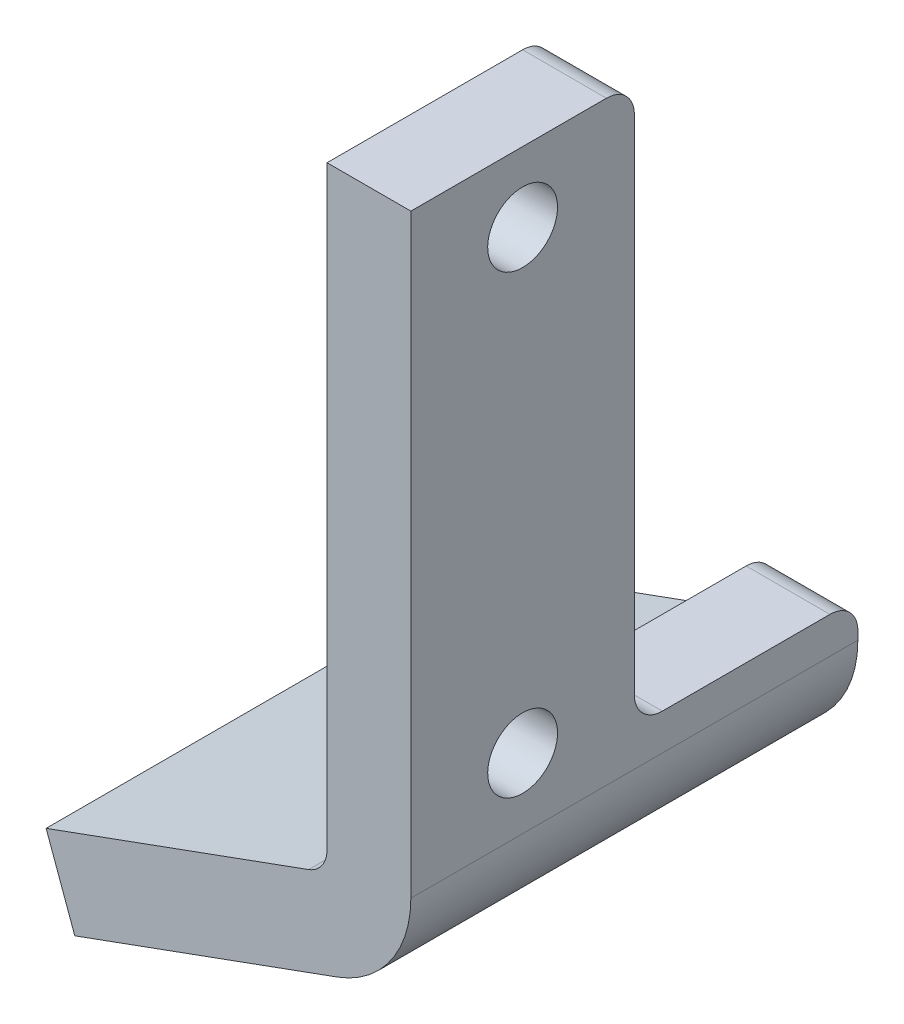
ISO-10303-21;
HEADER;
FILE_DESCRIPTION(('STEP AP214'),'2;1');
FILE_NAME('part.step','',(''),(''),'','','');
FILE_SCHEMA(('AUTOMOTIVE_DESIGN { 1 0 10303 214 1 1 1 1 }'));
ENDSEC;
DATA;
#1=APPLICATION_CONTEXT('core data for automotive mechanical design processes');
#2=APPLICATION_PROTOCOL_DEFINITION('international standard','automotive_design',2000,#1);
#3=PRODUCT_CONTEXT('',#1,'mechanical');
#4=PRODUCT('Part','Part','',(#3));
#5=PRODUCT_RELATED_PRODUCT_CATEGORY('part','',(#4));
#6=PRODUCT_DEFINITION_FORMATION('','',#4);
#7=PRODUCT_DEFINITION_CONTEXT('part definition',#1,'design');
#8=PRODUCT_DEFINITION('design','',#6,#7);
#9=PRODUCT_DEFINITION_SHAPE('','',#8);
#10=(LENGTH_UNIT() NAMED_UNIT(*) SI_UNIT(.MILLI.,.METRE.));
#11=(NAMED_UNIT(*) PLANE_ANGLE_UNIT() SI_UNIT($,.RADIAN.));
#12=(NAMED_UNIT(*) SI_UNIT($,.STERADIAN.) SOLID_ANGLE_UNIT());
#13=UNCERTAINTY_MEASURE_WITH_UNIT(LENGTH_MEASURE(1.E-05),#10,'distance_accuracy_value','');
#14=(GEOMETRIC_REPRESENTATION_CONTEXT(3) GLOBAL_UNCERTAINTY_ASSIGNED_CONTEXT((#13)) GLOBAL_UNIT_ASSIGNED_CONTEXT((#10,
#11,#12)) REPRESENTATION_CONTEXT('',''));
#15=CARTESIAN_POINT('',(0.,0.,0.));
#16=DIRECTION('',(0.,0.,1.));
#17=DIRECTION('',(1.,0.,0.));
#18=AXIS2_PLACEMENT_3D('',#15,#16,#17);
#19=CARTESIAN_POINT('',(-1.5,20.3,-16.));
#20=DIRECTION('',(-1.,0.,0.));
#21=DIRECTION('',(0.,-1.,0.));
#22=AXIS2_PLACEMENT_3D('',#19,#20,#21);
#23=PLANE('',#22);
#24=DIRECTION('',(0.,0.,1.));
#25=VECTOR('',#24,1.);
#26=CARTESIAN_POINT('',(-1.5,0.299999999999998,-8.));
#27=LINE('',#26,#25);
#28=CARTESIAN_POINT('',(-1.5,0.300000000000001,-15.));
#29=VERTEX_POINT('',#28);
#30=CARTESIAN_POINT('',(-1.5,0.299999999999998,-9.));
#31=VERTEX_POINT('',#30);
#32=EDGE_CURVE('E226',#29,#31,#27,.T.);
#33=ORIENTED_EDGE('',*,*,#32,.F.);
#34=CARTESIAN_POINT('',(-1.5,-0.699999999999999,-15.));
#35=DIRECTION('',(-1.,0.,0.));
#36=DIRECTION('',(0.,-1.,0.));
#37=AXIS2_PLACEMENT_3D('',#34,#35,#36);
#38=CIRCLE('',#37,1.);
#39=CARTESIAN_POINT('',(-1.5,-0.699999999999999,-16.));
#40=VERTEX_POINT('',#39);
#41=EDGE_CURVE('E135',#29,#40,#38,.T.);
#42=ORIENTED_EDGE('',*,*,#41,.T.);
#43=DIRECTION('',(0.,-1.,0.));
#44=VECTOR('',#43,1.);
#45=CARTESIAN_POINT('',(-1.5,20.3,-16.));
#46=LINE('',#45,#44);
#47=CARTESIAN_POINT('',(-1.5,-1.,-16.));
#48=VERTEX_POINT('',#47);
#49=EDGE_CURVE('E128',#40,#48,#46,.T.);
#50=ORIENTED_EDGE('',*,*,#49,.T.);
#51=DIRECTION('',(0.,0.,1.));
#52=VECTOR('',#51,1.);
#53=CARTESIAN_POINT('',(-1.5,-1.,-16.));
#54=LINE('',#53,#52);
#55=CARTESIAN_POINT('',(-1.5,-1.,0.));
#56=VERTEX_POINT('',#55);
#57=EDGE_CURVE('E133',#48,#56,#54,.T.);
#58=ORIENTED_EDGE('',*,*,#57,.T.);
#59=DIRECTION('',(0.,-1.,0.));
#60=VECTOR('',#59,1.);
#61=CARTESIAN_POINT('',(-1.5,20.3,0.));
#62=LINE('',#61,#60);
#63=CARTESIAN_POINT('',(-1.5,20.3,0.));
#64=VERTEX_POINT('',#63);
#65=EDGE_CURVE('E171',#64,#56,#62,.T.);
#66=ORIENTED_EDGE('',*,*,#65,.F.);
#67=DIRECTION('',(0.,0.,1.));
#68=VECTOR('',#67,1.);
#69=CARTESIAN_POINT('',(-1.5,20.3,-16.));
#70=LINE('',#69,#68);
#71=CARTESIAN_POINT('',(-1.5,20.3,-7.));
#72=VERTEX_POINT('',#71);
#73=EDGE_CURVE('E192',#72,#64,#70,.T.);
#74=ORIENTED_EDGE('',*,*,#73,.F.);
#75=CARTESIAN_POINT('',(-1.5,19.3,-7.));
#76=DIRECTION('',(-1.,0.,0.));
#77=DIRECTION('',(0.,-1.,0.));
#78=AXIS2_PLACEMENT_3D('',#75,#76,#77);
#79=CIRCLE('',#78,1.);
#80=CARTESIAN_POINT('',(-1.5,19.3,-8.));
#81=VERTEX_POINT('',#80);
#82=EDGE_CURVE('E210',#72,#81,#79,.T.);
#83=ORIENTED_EDGE('',*,*,#82,.T.);
#84=DIRECTION('',(0.,1.,0.));
#85=VECTOR('',#84,1.);
#86=CARTESIAN_POINT('',(-1.5,20.3,-8.));
#87=LINE('',#86,#85);
#88=CARTESIAN_POINT('',(-1.5,1.3,-8.));
#89=VERTEX_POINT('',#88);
#90=EDGE_CURVE('E227',#89,#81,#87,.T.);
#91=ORIENTED_EDGE('',*,*,#90,.F.);
#92=CARTESIAN_POINT('',(-1.5,1.3,-9.));
#93=DIRECTION('',(-1.,0.,0.));
#94=DIRECTION('',(0.,-1.,0.));
#95=AXIS2_PLACEMENT_3D('',#92,#93,#94);
#96=CIRCLE('',#95,1.);
#97=EDGE_CURVE('E41',#89,#31,#96,.F.);
#98=ORIENTED_EDGE('',*,*,#97,.T.);
#99=EDGE_LOOP('',(#33,#42,#50,#58,#66,#74,#83,#91,#98));
#100=FACE_BOUND('',#99,.T.);
#101=CARTESIAN_POINT('',(-1.5,1.5,-4.));
#102=DIRECTION('',(-1.,0.,0.));
#103=DIRECTION('',(0.,-1.,0.));
#104=AXIS2_PLACEMENT_3D('',#101,#102,#103);
#105=CIRCLE('',#104,1.25);
#106=CARTESIAN_POINT('',(-1.5,0.249999999999997,-4.));
#107=VERTEX_POINT('',#106);
#108=EDGE_CURVE('E244',#107,#107,#105,.T.);
#109=ORIENTED_EDGE('',*,*,#108,.F.);
#110=EDGE_LOOP('',(#109));
#111=FACE_BOUND('',#110,.T.);
#112=CARTESIAN_POINT('',(-1.5,17.8,-4.));
#113=DIRECTION('',(-1.,0.,0.));
#114=DIRECTION('',(0.,-1.,0.));
#115=AXIS2_PLACEMENT_3D('',#112,#113,#114);
#116=CIRCLE('',#115,1.25);
#117=CARTESIAN_POINT('',(-1.5,16.55,-4.));
#118=VERTEX_POINT('',#117);
#119=EDGE_CURVE('E256',#118,#118,#116,.T.);
#120=ORIENTED_EDGE('',*,*,#119,.F.);
#121=EDGE_LOOP('',(#120));
#122=FACE_BOUND('',#121,.T.);
#123=ADVANCED_FACE('F33',(#100,#111,#122),#23,.T.);
#124=CARTESIAN_POINT('',(-1.5,20.3,-16.));
#125=DIRECTION('',(0.,1.,0.));
#126=DIRECTION('',(0.,0.,1.));
#127=AXIS2_PLACEMENT_3D('',#124,#125,#126);
#128=PLANE('',#127);
#129=DIRECTION('',(0.,0.,1.));
#130=VECTOR('',#129,1.);
#131=CARTESIAN_POINT('',(1.5,20.3,-16.));
#132=LINE('',#131,#130);
#133=CARTESIAN_POINT('',(1.5,20.3,-7.));
#134=VERTEX_POINT('',#133);
#135=CARTESIAN_POINT('',(1.5,20.3,0.));
#136=VERTEX_POINT('',#135);
#137=EDGE_CURVE('E195',#134,#136,#132,.T.);
#138=ORIENTED_EDGE('',*,*,#137,.F.);
#139=DIRECTION('',(-1.,0.,0.));
#140=VECTOR('',#139,1.);
#141=CARTESIAN_POINT('',(-1.5,20.3,-7.));
#142=LINE('',#141,#140);
#143=EDGE_CURVE('E222',#134,#72,#142,.T.);
#144=ORIENTED_EDGE('',*,*,#143,.T.);
#145=ORIENTED_EDGE('',*,*,#73,.T.);
#146=DIRECTION('',(-1.,0.,0.));
#147=VECTOR('',#146,1.);
#148=CARTESIAN_POINT('',(-1.5,20.3,0.));
#149=LINE('',#148,#147);
#150=EDGE_CURVE('E140',#136,#64,#149,.T.);
#151=ORIENTED_EDGE('',*,*,#150,.F.);
#152=EDGE_LOOP('',(#138,#144,#145,#151));
#153=FACE_BOUND('',#152,.T.);
#154=ADVANCED_FACE('F286',(#153),#128,.T.);
#155=CARTESIAN_POINT('',(1.5,20.3,-16.));
#156=DIRECTION('',(1.,0.,0.));
#157=DIRECTION('',(0.,1.,0.));
#158=AXIS2_PLACEMENT_3D('',#155,#156,#157);
#159=PLANE('',#158);
#160=DIRECTION('',(0.,1.,0.));
#161=VECTOR('',#160,1.);
#162=CARTESIAN_POINT('',(1.5,20.3,-16.));
#163=LINE('',#162,#161);
#164=CARTESIAN_POINT('',(1.5,-1.,-16.));
#165=VERTEX_POINT('',#164);
#166=CARTESIAN_POINT('',(1.5,-0.699999999999999,-16.));
#167=VERTEX_POINT('',#166);
#168=EDGE_CURVE('E149',#165,#167,#163,.T.);
#169=ORIENTED_EDGE('',*,*,#168,.T.);
#170=CARTESIAN_POINT('',(1.5,-0.699999999999999,-15.));
#171=DIRECTION('',(1.,0.,0.));
#172=DIRECTION('',(0.,1.,0.));
#173=AXIS2_PLACEMENT_3D('',#170,#171,#172);
#174=CIRCLE('',#173,1.);
#175=CARTESIAN_POINT('',(1.50000000000001,0.300000000000001,-15.));
#176=VERTEX_POINT('',#175);
#177=EDGE_CURVE('E216',#167,#176,#174,.T.);
#178=ORIENTED_EDGE('',*,*,#177,.T.);
#179=DIRECTION('',(0.,0.,1.));
#180=VECTOR('',#179,1.);
#181=CARTESIAN_POINT('',(1.50000000000001,0.299999999999998,-8.));
#182=LINE('',#181,#180);
#183=CARTESIAN_POINT('',(1.50000000000001,0.299999999999999,-9.));
#184=VERTEX_POINT('',#183);
#185=EDGE_CURVE('E242',#176,#184,#182,.T.);
#186=ORIENTED_EDGE('',*,*,#185,.T.);
#187=CARTESIAN_POINT('',(1.5,1.3,-9.));
#188=DIRECTION('',(1.,0.,0.));
#189=DIRECTION('',(0.,1.,0.));
#190=AXIS2_PLACEMENT_3D('',#187,#188,#189);
#191=CIRCLE('',#190,1.);
#192=CARTESIAN_POINT('',(1.50000000000001,1.3,-8.));
#193=VERTEX_POINT('',#192);
#194=EDGE_CURVE('E11',#184,#193,#191,.F.);
#195=ORIENTED_EDGE('',*,*,#194,.T.);
#196=DIRECTION('',(0.,1.,0.));
#197=VECTOR('',#196,1.);
#198=CARTESIAN_POINT('',(1.5,20.3,-8.));
#199=LINE('',#198,#197);
#200=CARTESIAN_POINT('',(1.5,19.3,-8.));
#201=VERTEX_POINT('',#200);
#202=EDGE_CURVE('E241',#193,#201,#199,.T.);
#203=ORIENTED_EDGE('',*,*,#202,.T.);
#204=CARTESIAN_POINT('',(1.5,19.3,-7.));
#205=DIRECTION('',(1.,0.,0.));
#206=DIRECTION('',(0.,1.,0.));
#207=AXIS2_PLACEMENT_3D('',#204,#205,#206);
#208=CIRCLE('',#207,1.);
#209=EDGE_CURVE('E48',#201,#134,#208,.T.);
#210=ORIENTED_EDGE('',*,*,#209,.T.);
#211=ORIENTED_EDGE('',*,*,#137,.T.);
#212=DIRECTION('',(0.,1.,0.));
#213=VECTOR('',#212,1.);
#214=CARTESIAN_POINT('',(1.5,20.3,0.));
#215=LINE('',#214,#213);
#216=CARTESIAN_POINT('',(1.5,-1.,0.));
#217=VERTEX_POINT('',#216);
#218=EDGE_CURVE('E187',#217,#136,#215,.T.);
#219=ORIENTED_EDGE('',*,*,#218,.F.);
#220=DIRECTION('',(0.,0.,1.));
#221=VECTOR('',#220,1.);
#222=CARTESIAN_POINT('',(1.5,-1.,-16.));
#223=LINE('',#222,#221);
#224=EDGE_CURVE('E197',#165,#217,#223,.T.);
#225=ORIENTED_EDGE('',*,*,#224,.F.);
#226=EDGE_LOOP('',(#169,#178,#186,#195,#203,#210,#211,#219,#225));
#227=FACE_BOUND('',#226,.T.);
#228=CARTESIAN_POINT('',(1.50000000000001,1.5,-4.));
#229=DIRECTION('',(-1.,0.,0.));
#230=DIRECTION('',(0.,-1.,0.));
#231=AXIS2_PLACEMENT_3D('',#228,#229,#230);
#232=CIRCLE('',#231,1.25);
#233=CARTESIAN_POINT('',(1.50000000000001,0.249999999999998,-4.));
#234=VERTEX_POINT('',#233);
#235=EDGE_CURVE('E247',#234,#234,#232,.T.);
#236=ORIENTED_EDGE('',*,*,#235,.T.);
#237=EDGE_LOOP('',(#236));
#238=FACE_BOUND('',#237,.T.);
#239=CARTESIAN_POINT('',(1.5,17.8,-4.));
#240=DIRECTION('',(-1.,0.,0.));
#241=DIRECTION('',(0.,-1.,0.));
#242=AXIS2_PLACEMENT_3D('',#239,#240,#241);
#243=CIRCLE('',#242,1.25);
#244=CARTESIAN_POINT('',(1.5,16.55,-4.));
#245=VERTEX_POINT('',#244);
#246=EDGE_CURVE('E252',#245,#245,#243,.T.);
#247=ORIENTED_EDGE('',*,*,#246,.T.);
#248=EDGE_LOOP('',(#247));
#249=FACE_BOUND('',#248,.T.);
#250=ADVANCED_FACE('F239',(#227,#238,#249),#159,.T.);
#251=CARTESIAN_POINT('',(-2.5,-1.,-16.));
#252=DIRECTION('',(0.,0.,1.));
#253=DIRECTION('',(1.,0.,0.));
#254=AXIS2_PLACEMENT_3D('',#251,#252,#253);
#255=CYLINDRICAL_SURFACE('',#254,4.);
#256=CARTESIAN_POINT('',(-2.5,-1.,0.));
#257=DIRECTION('',(0.,0.,1.));
#258=DIRECTION('',(-1.,0.,0.));
#259=AXIS2_PLACEMENT_3D('',#256,#257,#258);
#260=CIRCLE('',#259,4.);
#261=CARTESIAN_POINT('',(-1.13191942669734,-4.75877048314364,0.));
#262=VERTEX_POINT('',#261);
#263=EDGE_CURVE('E184',#262,#217,#260,.T.);
#264=ORIENTED_EDGE('',*,*,#263,.F.);
#265=DIRECTION('',(0.,0.,1.));
#266=VECTOR('',#265,1.);
#267=CARTESIAN_POINT('',(-1.13191942669734,-4.75877048314364,-16.));
#268=LINE('',#267,#266);
#269=CARTESIAN_POINT('',(-1.13191942669734,-4.75877048314364,-16.));
#270=VERTEX_POINT('',#269);
#271=EDGE_CURVE('E199',#270,#262,#268,.T.);
#272=ORIENTED_EDGE('',*,*,#271,.F.);
#273=CARTESIAN_POINT('',(-2.5,-1.,-16.));
#274=DIRECTION('',(0.,0.,1.));
#275=DIRECTION('',(-1.,0.,0.));
#276=AXIS2_PLACEMENT_3D('',#273,#274,#275);
#277=CIRCLE('',#276,4.);
#278=EDGE_CURVE('E166',#270,#165,#277,.T.);
#279=ORIENTED_EDGE('',*,*,#278,.T.);
#280=ORIENTED_EDGE('',*,*,#224,.T.);
#281=EDGE_LOOP('',(#264,#272,#279,#280));
#282=FACE_BOUND('',#281,.T.);
#283=ADVANCED_FACE('F270',(#282),#255,.T.);
#284=CARTESIAN_POINT('',(-10.5288456345564,-8.17897191640028,-16.));
#285=DIRECTION('',(0.342020143325663,-0.93969262078591,0.));
#286=DIRECTION('',(0.93969262078591,0.342020143325663,0.));
#287=AXIS2_PLACEMENT_3D('',#284,#285,#286);
#288=PLANE('',#287);
#289=CARTESIAN_POINT('',(-5.8303825306269,-6.46887119977196,-11.));
#290=DIRECTION('',(0.342020143325663,-0.93969262078591,0.));
#291=DIRECTION('',(0.93969262078591,0.342020143325663,0.));
#292=AXIS2_PLACEMENT_3D('',#289,#290,#291);
#293=CIRCLE('',#292,2.25);
#294=CARTESIAN_POINT('',(-3.7160741338586,-5.69932587728922,-11.));
#295=VERTEX_POINT('',#294);
#296=EDGE_CURVE('E173',#295,#295,#293,.T.);
#297=ORIENTED_EDGE('',*,*,#296,.F.);
#298=EDGE_LOOP('',(#297));
#299=FACE_BOUND('',#298,.T.);
#300=DIRECTION('',(0.93969262078591,0.342020143325663,0.));
#301=VECTOR('',#300,1.);
#302=CARTESIAN_POINT('',(-10.5288456345564,-8.17897191640028,0.));
#303=LINE('',#302,#301);
#304=CARTESIAN_POINT('',(-10.5288456345564,-8.17897191640028,0.));
#305=VERTEX_POINT('',#304);
#306=EDGE_CURVE('E181',#305,#262,#303,.T.);
#307=ORIENTED_EDGE('',*,*,#306,.F.);
#308=DIRECTION('',(0.,0.,1.));
#309=VECTOR('',#308,1.);
#310=CARTESIAN_POINT('',(-10.5288456345564,-8.17897191640028,-16.));
#311=LINE('',#310,#309);
#312=CARTESIAN_POINT('',(-10.5288456345564,-8.17897191640028,-16.));
#313=VERTEX_POINT('',#312);
#314=EDGE_CURVE('E201',#313,#305,#311,.T.);
#315=ORIENTED_EDGE('',*,*,#314,.F.);
#316=DIRECTION('',(0.93969262078591,0.342020143325663,0.));
#317=VECTOR('',#316,1.);
#318=CARTESIAN_POINT('',(-10.5288456345564,-8.17897191640028,-16.));
#319=LINE('',#318,#317);
#320=EDGE_CURVE('E163',#313,#270,#319,.T.);
#321=ORIENTED_EDGE('',*,*,#320,.T.);
#322=ORIENTED_EDGE('',*,*,#271,.T.);
#323=EDGE_LOOP('',(#307,#315,#321,#322));
#324=FACE_BOUND('',#323,.T.);
#325=ADVANCED_FACE('F266',(#299,#324),#288,.T.);
#326=CARTESIAN_POINT('',(-11.5549060645334,-5.35989405404254,-16.));
#327=DIRECTION('',(-0.93969262078591,-0.342020143325663,0.));
#328=DIRECTION('',(0.342020143325663,-0.93969262078591,0.));
#329=AXIS2_PLACEMENT_3D('',#326,#327,#328);
#330=PLANE('',#329);
#331=DIRECTION('',(0.342020143325663,-0.93969262078591,0.));
#332=VECTOR('',#331,1.);
#333=CARTESIAN_POINT('',(-11.5549060645334,-5.35989405404254,0.));
#334=LINE('',#333,#332);
#335=CARTESIAN_POINT('',(-11.5549060645334,-5.35989405404254,0.));
#336=VERTEX_POINT('',#335);
#337=EDGE_CURVE('E178',#336,#305,#334,.T.);
#338=ORIENTED_EDGE('',*,*,#337,.F.);
#339=DIRECTION('',(0.,0.,1.));
#340=VECTOR('',#339,1.);
#341=CARTESIAN_POINT('',(-11.5549060645334,-5.35989405404254,-16.));
#342=LINE('',#341,#340);
#343=CARTESIAN_POINT('',(-11.5549060645334,-5.35989405404254,-16.));
#344=VERTEX_POINT('',#343);
#345=EDGE_CURVE('E203',#344,#336,#342,.T.);
#346=ORIENTED_EDGE('',*,*,#345,.F.);
#347=DIRECTION('',(0.342020143325663,-0.93969262078591,0.));
#348=VECTOR('',#347,1.);
#349=CARTESIAN_POINT('',(-11.5549060645334,-5.35989405404254,-16.));
#350=LINE('',#349,#348);
#351=EDGE_CURVE('E157',#344,#313,#350,.T.);
#352=ORIENTED_EDGE('',*,*,#351,.T.);
#353=ORIENTED_EDGE('',*,*,#314,.T.);
#354=EDGE_LOOP('',(#338,#346,#352,#353));
#355=FACE_BOUND('',#354,.T.);
#356=ADVANCED_FACE('F269',(#355),#330,.T.);
#357=CARTESIAN_POINT('',(-2.15797985667434,-1.93969262078591,-16.));
#358=DIRECTION('',(-0.342020143325663,0.93969262078591,0.));
#359=DIRECTION('',(-0.939692620785911,-0.342020143325663,0.));
#360=AXIS2_PLACEMENT_3D('',#357,#358,#359);
#361=PLANE('',#360);
#362=CARTESIAN_POINT('',(-6.85644296060389,-3.64979333741423,-11.));
#363=DIRECTION('',(-0.342020143325663,0.939692620785911,0.));
#364=DIRECTION('',(-0.93969262078591,-0.342020143325663,0.));
#365=AXIS2_PLACEMENT_3D('',#362,#363,#364);
#366=CIRCLE('',#365,2.25);
#367=CARTESIAN_POINT('',(-8.97075135737219,-4.41933865989697,-11.));
#368=VERTEX_POINT('',#367);
#369=EDGE_CURVE('E255',#368,#368,#366,.T.);
#370=ORIENTED_EDGE('',*,*,#369,.F.);
#371=EDGE_LOOP('',(#370));
#372=FACE_BOUND('',#371,.T.);
#373=DIRECTION('',(-0.93969262078591,-0.342020143325663,0.));
#374=VECTOR('',#373,1.);
#375=CARTESIAN_POINT('',(-2.15797985667434,-1.93969262078591,0.));
#376=LINE('',#375,#374);
#377=CARTESIAN_POINT('',(-2.15797985667434,-1.93969262078591,0.));
#378=VERTEX_POINT('',#377);
#379=EDGE_CURVE('E175',#378,#336,#376,.T.);
#380=ORIENTED_EDGE('',*,*,#379,.F.);
#381=DIRECTION('',(0.,0.,1.));
#382=VECTOR('',#381,1.);
#383=CARTESIAN_POINT('',(-2.15797985667434,-1.93969262078591,-16.));
#384=LINE('',#383,#382);
#385=CARTESIAN_POINT('',(-2.15797985667434,-1.93969262078591,-16.));
#386=VERTEX_POINT('',#385);
#387=EDGE_CURVE('E148',#386,#378,#384,.T.);
#388=ORIENTED_EDGE('',*,*,#387,.F.);
#389=DIRECTION('',(-0.93969262078591,-0.342020143325663,0.));
#390=VECTOR('',#389,1.);
#391=CARTESIAN_POINT('',(-2.15797985667434,-1.93969262078591,-16.));
#392=LINE('',#391,#390);
#393=EDGE_CURVE('E155',#386,#344,#392,.T.);
#394=ORIENTED_EDGE('',*,*,#393,.T.);
#395=ORIENTED_EDGE('',*,*,#345,.T.);
#396=EDGE_LOOP('',(#380,#388,#394,#395));
#397=FACE_BOUND('',#396,.T.);
#398=ADVANCED_FACE('F282',(#372,#397),#361,.T.);
#399=CARTESIAN_POINT('',(-2.5,-1.,-16.));
#400=DIRECTION('',(0.,0.,1.));
#401=DIRECTION('',(1.,0.,0.));
#402=AXIS2_PLACEMENT_3D('',#399,#400,#401);
#403=CYLINDRICAL_SURFACE('',#402,0.999999999999999);
#404=CARTESIAN_POINT('',(-2.5,-1.,0.));
#405=DIRECTION('',(0.,0.,-1.));
#406=DIRECTION('',(-1.,0.,0.));
#407=AXIS2_PLACEMENT_3D('',#404,#405,#406);
#408=CIRCLE('',#407,0.999999999999999);
#409=EDGE_CURVE('E146',#56,#378,#408,.T.);
#410=ORIENTED_EDGE('',*,*,#409,.F.);
#411=ORIENTED_EDGE('',*,*,#57,.F.);
#412=CARTESIAN_POINT('',(-2.5,-1.,-16.));
#413=DIRECTION('',(0.,0.,-1.));
#414=DIRECTION('',(-1.,0.,0.));
#415=AXIS2_PLACEMENT_3D('',#412,#413,#414);
#416=CIRCLE('',#415,0.999999999999999);
#417=EDGE_CURVE('E139',#48,#386,#416,.T.);
#418=ORIENTED_EDGE('',*,*,#417,.T.);
#419=ORIENTED_EDGE('',*,*,#387,.T.);
#420=EDGE_LOOP('',(#410,#411,#418,#419));
#421=FACE_BOUND('',#420,.T.);
#422=ADVANCED_FACE('F144',(#421),#403,.F.);
#423=CARTESIAN_POINT('',(-2.5,-1.,-16.));
#424=DIRECTION('',(0.,0.,-1.));
#425=DIRECTION('',(-1.,0.,0.));
#426=AXIS2_PLACEMENT_3D('',#423,#424,#425);
#427=PLANE('',#426);
#428=ORIENTED_EDGE('',*,*,#49,.F.);
#429=DIRECTION('',(-1.,0.,0.));
#430=VECTOR('',#429,1.);
#431=CARTESIAN_POINT('',(1.5,-0.699999999999999,-16.));
#432=LINE('',#431,#430);
#433=EDGE_CURVE('E213',#40,#167,#432,.F.);
#434=ORIENTED_EDGE('',*,*,#433,.T.);
#435=ORIENTED_EDGE('',*,*,#168,.F.);
#436=ORIENTED_EDGE('',*,*,#278,.F.);
#437=ORIENTED_EDGE('',*,*,#320,.F.);
#438=ORIENTED_EDGE('',*,*,#351,.F.);
#439=ORIENTED_EDGE('',*,*,#393,.F.);
#440=ORIENTED_EDGE('',*,*,#417,.F.);
#441=EDGE_LOOP('',(#428,#434,#435,#436,#437,#438,#439,#440));
#442=FACE_BOUND('',#441,.T.);
#443=ADVANCED_FACE('F152',(#442),#427,.T.);
#444=CARTESIAN_POINT('',(-2.5,-1.,0.));
#445=DIRECTION('',(0.,0.,-1.));
#446=DIRECTION('',(-1.,0.,0.));
#447=AXIS2_PLACEMENT_3D('',#444,#445,#446);
#448=PLANE('',#447);
#449=ORIENTED_EDGE('',*,*,#65,.T.);
#450=ORIENTED_EDGE('',*,*,#409,.T.);
#451=ORIENTED_EDGE('',*,*,#379,.T.);
#452=ORIENTED_EDGE('',*,*,#337,.T.);
#453=ORIENTED_EDGE('',*,*,#306,.T.);
#454=ORIENTED_EDGE('',*,*,#263,.T.);
#455=ORIENTED_EDGE('',*,*,#218,.T.);
#456=ORIENTED_EDGE('',*,*,#150,.T.);
#457=EDGE_LOOP('',(#449,#450,#451,#452,#453,#454,#455,#456));
#458=FACE_BOUND('',#457,.T.);
#459=ADVANCED_FACE('F277',(#458),#448,.F.);
#460=CARTESIAN_POINT('',(-4.42327489109269,-10.3348676661344,-11.));
#461=DIRECTION('',(-0.342020143325663,0.939692620785911,0.));
#462=DIRECTION('',(-0.939692620785911,-0.342020143325663,0.));
#463=AXIS2_PLACEMENT_3D('',#460,#461,#462);
#464=CYLINDRICAL_SURFACE('',#463,2.25);
#465=ORIENTED_EDGE('',*,*,#296,.T.);
#466=EDGE_LOOP('',(#465));
#467=FACE_BOUND('',#466,.T.);
#468=ORIENTED_EDGE('',*,*,#369,.T.);
#469=EDGE_LOOP('',(#468));
#470=FACE_BOUND('',#469,.T.);
#471=ADVANCED_FACE('F263',(#467,#470),#464,.F.);
#472=CARTESIAN_POINT('',(1.5,20.3,-8.));
#473=DIRECTION('',(0.,0.,1.));
#474=DIRECTION('',(0.,-1.,0.));
#475=AXIS2_PLACEMENT_3D('',#472,#473,#474);
#476=PLANE('',#475);
#477=ORIENTED_EDGE('',*,*,#202,.F.);
#478=DIRECTION('',(-1.,0.,0.));
#479=VECTOR('',#478,1.);
#480=CARTESIAN_POINT('',(-1.5,1.3,-8.));
#481=LINE('',#480,#479);
#482=EDGE_CURVE('E219',#193,#89,#481,.T.);
#483=ORIENTED_EDGE('',*,*,#482,.T.);
#484=ORIENTED_EDGE('',*,*,#90,.T.);
#485=DIRECTION('',(-1.,0.,0.));
#486=VECTOR('',#485,1.);
#487=CARTESIAN_POINT('',(1.5,19.3,-8.));
#488=LINE('',#487,#486);
#489=EDGE_CURVE('E56',#81,#201,#488,.F.);
#490=ORIENTED_EDGE('',*,*,#489,.T.);
#491=EDGE_LOOP('',(#477,#483,#484,#490));
#492=FACE_BOUND('',#491,.T.);
#493=ADVANCED_FACE('F243',(#492),#476,.F.);
#494=CARTESIAN_POINT('',(1.50000000000001,0.299999999999998,-8.));
#495=DIRECTION('',(0.,-1.,0.));
#496=DIRECTION('',(0.,0.,-1.));
#497=AXIS2_PLACEMENT_3D('',#494,#495,#496);
#498=PLANE('',#497);
#499=ORIENTED_EDGE('',*,*,#185,.F.);
#500=DIRECTION('',(-1.,0.,0.));
#501=VECTOR('',#500,1.);
#502=CARTESIAN_POINT('',(-1.5,0.300000000000001,-15.));
#503=LINE('',#502,#501);
#504=EDGE_CURVE('E207',#176,#29,#503,.T.);
#505=ORIENTED_EDGE('',*,*,#504,.T.);
#506=ORIENTED_EDGE('',*,*,#32,.T.);
#507=DIRECTION('',(-1.,0.,0.));
#508=VECTOR('',#507,1.);
#509=CARTESIAN_POINT('',(1.50000000000001,0.299999999999999,-9.));
#510=LINE('',#509,#508);
#511=EDGE_CURVE('E194',#31,#184,#510,.F.);
#512=ORIENTED_EDGE('',*,*,#511,.T.);
#513=EDGE_LOOP('',(#499,#505,#506,#512));
#514=FACE_BOUND('',#513,.T.);
#515=ADVANCED_FACE('F233',(#514),#498,.F.);
#516=CARTESIAN_POINT('',(1.5,17.8,-4.));
#517=DIRECTION('',(-1.,0.,0.));
#518=DIRECTION('',(0.,-1.,0.));
#519=AXIS2_PLACEMENT_3D('',#516,#517,#518);
#520=CYLINDRICAL_SURFACE('',#519,1.25);
#521=ORIENTED_EDGE('',*,*,#246,.F.);
#522=EDGE_LOOP('',(#521));
#523=FACE_BOUND('',#522,.T.);
#524=ORIENTED_EDGE('',*,*,#119,.T.);
#525=EDGE_LOOP('',(#524));
#526=FACE_BOUND('',#525,.T.);
#527=ADVANCED_FACE('F309',(#523,#526),#520,.F.);
#528=CARTESIAN_POINT('',(1.50000000000001,1.5,-4.));
#529=DIRECTION('',(-1.,0.,0.));
#530=DIRECTION('',(0.,-1.,0.));
#531=AXIS2_PLACEMENT_3D('',#528,#529,#530);
#532=CYLINDRICAL_SURFACE('',#531,1.25);
#533=ORIENTED_EDGE('',*,*,#235,.F.);
#534=EDGE_LOOP('',(#533));
#535=FACE_BOUND('',#534,.T.);
#536=ORIENTED_EDGE('',*,*,#108,.T.);
#537=EDGE_LOOP('',(#536));
#538=FACE_BOUND('',#537,.T.);
#539=ADVANCED_FACE('F304',(#535,#538),#532,.F.);
#540=CARTESIAN_POINT('',(1.50000000000001,-0.699999999999999,-15.));
#541=DIRECTION('',(1.,0.,0.));
#542=DIRECTION('',(0.,1.,0.));
#543=AXIS2_PLACEMENT_3D('',#540,#541,#542);
#544=CYLINDRICAL_SURFACE('',#543,1.);
#545=ORIENTED_EDGE('',*,*,#177,.F.);
#546=ORIENTED_EDGE('',*,*,#433,.F.);
#547=ORIENTED_EDGE('',*,*,#41,.F.);
#548=ORIENTED_EDGE('',*,*,#504,.F.);
#549=EDGE_LOOP('',(#545,#546,#547,#548));
#550=FACE_BOUND('',#549,.T.);
#551=ADVANCED_FACE('F293',(#550),#544,.T.);
#552=CARTESIAN_POINT('',(1.50000000000001,1.3,-9.));
#553=DIRECTION('',(1.,0.,0.));
#554=DIRECTION('',(0.,1.,0.));
#555=AXIS2_PLACEMENT_3D('',#552,#553,#554);
#556=CYLINDRICAL_SURFACE('',#555,1.);
#557=ORIENTED_EDGE('',*,*,#194,.F.);
#558=ORIENTED_EDGE('',*,*,#511,.F.);
#559=ORIENTED_EDGE('',*,*,#97,.F.);
#560=ORIENTED_EDGE('',*,*,#482,.F.);
#561=EDGE_LOOP('',(#557,#558,#559,#560));
#562=FACE_BOUND('',#561,.T.);
#563=ADVANCED_FACE('F238',(#562),#556,.F.);
#564=CARTESIAN_POINT('',(-1.5,19.3,-7.));
#565=DIRECTION('',(1.,0.,0.));
#566=DIRECTION('',(0.,0.,-1.));
#567=AXIS2_PLACEMENT_3D('',#564,#565,#566);
#568=CYLINDRICAL_SURFACE('',#567,1.);
#569=ORIENTED_EDGE('',*,*,#209,.F.);
#570=ORIENTED_EDGE('',*,*,#489,.F.);
#571=ORIENTED_EDGE('',*,*,#82,.F.);
#572=ORIENTED_EDGE('',*,*,#143,.F.);
#573=EDGE_LOOP('',(#569,#570,#571,#572));
#574=FACE_BOUND('',#573,.T.);
#575=ADVANCED_FACE('F35',(#574),#568,.T.);
#576=CLOSED_SHELL('',(#123,#154,#250,#283,#325,#356,#398,#422,#443,#459,#471,#493,#515,#527,
#539,#551,#563,#575));
#577=MANIFOLD_SOLID_BREP('B2',#576);
#578=ADVANCED_BREP_SHAPE_REPRESENTATION('',(#18,#577),#14);
#579=SHAPE_DEFINITION_REPRESENTATION(#9,#578);
ENDSEC;
END-ISO-10303-21;
